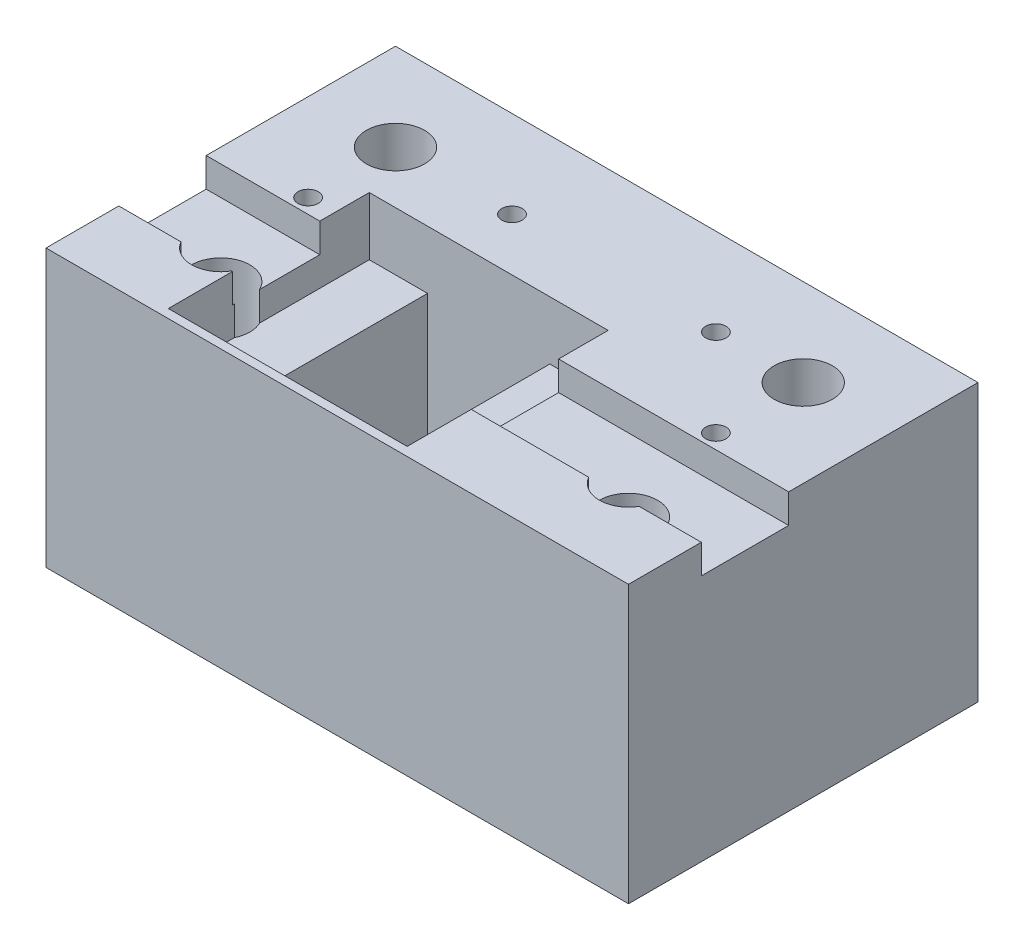
ISO-10303-21;
HEADER;
FILE_DESCRIPTION(('STEP AP214'),'2;1');
FILE_NAME('part.step','',(''),(''),'','','');
FILE_SCHEMA(('AUTOMOTIVE_DESIGN { 1 0 10303 214 1 1 1 1 }'));
ENDSEC;
DATA;
#1=APPLICATION_CONTEXT('core data for automotive mechanical design processes');
#2=APPLICATION_PROTOCOL_DEFINITION('international standard','automotive_design',2000,#1);
#3=PRODUCT_CONTEXT('',#1,'mechanical');
#4=PRODUCT('Part','Part','',(#3));
#5=PRODUCT_RELATED_PRODUCT_CATEGORY('part','',(#4));
#6=PRODUCT_DEFINITION_FORMATION('','',#4);
#7=PRODUCT_DEFINITION_CONTEXT('part definition',#1,'design');
#8=PRODUCT_DEFINITION('design','',#6,#7);
#9=PRODUCT_DEFINITION_SHAPE('','',#8);
#10=(LENGTH_UNIT() NAMED_UNIT(*) SI_UNIT(.MILLI.,.METRE.));
#11=(NAMED_UNIT(*) PLANE_ANGLE_UNIT() SI_UNIT($,.RADIAN.));
#12=(NAMED_UNIT(*) SI_UNIT($,.STERADIAN.) SOLID_ANGLE_UNIT());
#13=UNCERTAINTY_MEASURE_WITH_UNIT(LENGTH_MEASURE(1.E-05),#10,'distance_accuracy_value','');
#14=(GEOMETRIC_REPRESENTATION_CONTEXT(3) GLOBAL_UNCERTAINTY_ASSIGNED_CONTEXT((#13)) GLOBAL_UNIT_ASSIGNED_CONTEXT((#10,
#11,#12)) REPRESENTATION_CONTEXT('',''));
#15=CARTESIAN_POINT('',(0.,0.,0.));
#16=DIRECTION('',(0.,0.,1.));
#17=DIRECTION('',(1.,0.,0.));
#18=AXIS2_PLACEMENT_3D('',#15,#16,#17);
#19=CARTESIAN_POINT('',(0.,8.5,0.));
#20=DIRECTION('',(0.,1.,0.));
#21=DIRECTION('',(0.,0.,1.));
#22=AXIS2_PLACEMENT_3D('',#19,#20,#21);
#23=PLANE('',#22);
#24=CARTESIAN_POINT('',(3.,8.5,9.));
#25=DIRECTION('',(0.,1.,0.));
#26=DIRECTION('',(0.,0.,1.));
#27=AXIS2_PLACEMENT_3D('',#24,#25,#26);
#28=CIRCLE('',#27,1.);
#29=CARTESIAN_POINT('',(3.86602540378444,8.5,9.5));
#30=VERTEX_POINT('',#29);
#31=CARTESIAN_POINT('',(3.9,8.5,9.43588989435407));
#32=VERTEX_POINT('',#31);
#33=EDGE_CURVE('E462',#30,#32,#28,.T.);
#34=ORIENTED_EDGE('',*,*,#33,.F.);
#35=DIRECTION('',(1.,0.,0.));
#36=VECTOR('',#35,1.);
#37=CARTESIAN_POINT('',(0.,8.5,9.5));
#38=LINE('',#37,#36);
#39=CARTESIAN_POINT('',(3.9,8.5,9.5));
#40=VERTEX_POINT('',#39);
#41=EDGE_CURVE('E429',#30,#40,#38,.T.);
#42=ORIENTED_EDGE('',*,*,#41,.T.);
#43=DIRECTION('',(0.,0.,1.));
#44=VECTOR('',#43,1.);
#45=CARTESIAN_POINT('',(3.9,8.5,0.));
#46=LINE('',#45,#44);
#47=EDGE_CURVE('E344',#32,#40,#46,.T.);
#48=ORIENTED_EDGE('',*,*,#47,.F.);
#49=EDGE_LOOP('',(#34,#42,#48));
#50=FACE_BOUND('',#49,.T.);
#51=ADVANCED_FACE('F61',(#50),#23,.T.);
#52=CARTESIAN_POINT('',(3.9,7.5,0.));
#53=DIRECTION('',(-1.,0.,0.));
#54=DIRECTION('',(0.,0.,1.));
#55=AXIS2_PLACEMENT_3D('',#52,#53,#54);
#56=PLANE('',#55);
#57=DIRECTION('',(0.,0.,1.));
#58=VECTOR('',#57,1.);
#59=CARTESIAN_POINT('',(3.9,7.5,0.));
#60=LINE('',#59,#58);
#61=CARTESIAN_POINT('',(3.9,7.5,9.43588989435407));
#62=VERTEX_POINT('',#61);
#63=CARTESIAN_POINT('',(3.9,7.5,11.7));
#64=VERTEX_POINT('',#63);
#65=EDGE_CURVE('E389',#62,#64,#60,.T.);
#66=ORIENTED_EDGE('',*,*,#65,.F.);
#67=DIRECTION('',(0.,1.,0.));
#68=VECTOR('',#67,1.);
#69=CARTESIAN_POINT('',(3.9,-2.82842712474619,9.43588989435407));
#70=LINE('',#69,#68);
#71=EDGE_CURVE('E83',#62,#32,#70,.T.);
#72=ORIENTED_EDGE('',*,*,#71,.T.);
#73=ORIENTED_EDGE('',*,*,#47,.T.);
#74=DIRECTION('',(0.,-1.,0.));
#75=VECTOR('',#74,1.);
#76=CARTESIAN_POINT('',(3.9,8.5,9.5));
#77=LINE('',#76,#75);
#78=CARTESIAN_POINT('',(3.9,9.5,9.5));
#79=VERTEX_POINT('',#78);
#80=EDGE_CURVE('E416',#79,#40,#77,.T.);
#81=ORIENTED_EDGE('',*,*,#80,.F.);
#82=DIRECTION('',(0.,0.,1.));
#83=VECTOR('',#82,1.);
#84=CARTESIAN_POINT('',(3.9,9.5,0.));
#85=LINE('',#84,#83);
#86=CARTESIAN_POINT('',(3.9,9.5,11.7));
#87=VERTEX_POINT('',#86);
#88=EDGE_CURVE('E399',#79,#87,#85,.T.);
#89=ORIENTED_EDGE('',*,*,#88,.T.);
#90=DIRECTION('',(0.,1.,0.));
#91=VECTOR('',#90,1.);
#92=CARTESIAN_POINT('',(3.9,7.5,11.7));
#93=LINE('',#92,#91);
#94=EDGE_CURVE('E408',#64,#87,#93,.T.);
#95=ORIENTED_EDGE('',*,*,#94,.F.);
#96=EDGE_LOOP('',(#66,#72,#73,#81,#89,#95));
#97=FACE_BOUND('',#96,.T.);
#98=ADVANCED_FACE('F545',(#97),#56,.F.);
#99=CARTESIAN_POINT('',(0.,8.5,9.5));
#100=DIRECTION('',(0.,0.,1.));
#101=DIRECTION('',(1.,0.,0.));
#102=AXIS2_PLACEMENT_3D('',#99,#100,#101);
#103=PLANE('',#102);
#104=CARTESIAN_POINT('',(17.8660254037844,8.5,9.5));
#105=VERTEX_POINT('',#104);
#106=CARTESIAN_POINT('',(20.,8.5,9.5));
#107=VERTEX_POINT('',#106);
#108=EDGE_CURVE('E248',#105,#107,#38,.T.);
#109=ORIENTED_EDGE('',*,*,#108,.F.);
#110=DIRECTION('',(0.,1.,0.));
#111=VECTOR('',#110,1.);
#112=CARTESIAN_POINT('',(17.8660254037844,-2.82842712474619,9.5));
#113=LINE('',#112,#111);
#114=CARTESIAN_POINT('',(17.8660254037844,9.5,9.5));
#115=VERTEX_POINT('',#114);
#116=EDGE_CURVE('E234',#105,#115,#113,.T.);
#117=ORIENTED_EDGE('',*,*,#116,.T.);
#118=DIRECTION('',(1.,0.,0.));
#119=VECTOR('',#118,1.);
#120=CARTESIAN_POINT('',(0.,9.5,9.5));
#121=LINE('',#120,#119);
#122=CARTESIAN_POINT('',(20.,9.5,9.5));
#123=VERTEX_POINT('',#122);
#124=EDGE_CURVE('E246',#115,#123,#121,.T.);
#125=ORIENTED_EDGE('',*,*,#124,.T.);
#126=DIRECTION('',(0.,1.,0.));
#127=VECTOR('',#126,1.);
#128=CARTESIAN_POINT('',(20.,8.5,9.5));
#129=LINE('',#128,#127);
#130=EDGE_CURVE('E292',#107,#123,#129,.T.);
#131=ORIENTED_EDGE('',*,*,#130,.F.);
#132=EDGE_LOOP('',(#109,#117,#125,#131));
#133=FACE_BOUND('',#132,.T.);
#134=ADVANCED_FACE('F244',(#133),#103,.F.);
#135=ORIENTED_EDGE('',*,*,#41,.F.);
#136=DIRECTION('',(0.,1.,0.));
#137=VECTOR('',#136,1.);
#138=CARTESIAN_POINT('',(3.86602540378444,-2.82842712474619,9.5));
#139=LINE('',#138,#137);
#140=CARTESIAN_POINT('',(3.86602540378444,9.5,9.5));
#141=VERTEX_POINT('',#140);
#142=EDGE_CURVE('E468',#30,#141,#139,.T.);
#143=ORIENTED_EDGE('',*,*,#142,.T.);
#144=EDGE_CURVE('E259',#141,#79,#121,.T.);
#145=ORIENTED_EDGE('',*,*,#144,.T.);
#146=ORIENTED_EDGE('',*,*,#80,.T.);
#147=EDGE_LOOP('',(#135,#143,#145,#146));
#148=FACE_BOUND('',#147,.T.);
#149=ADVANCED_FACE('F548',(#148),#103,.F.);
#150=CARTESIAN_POINT('',(0.,9.5,0.));
#151=DIRECTION('',(0.,-1.,0.));
#152=DIRECTION('',(0.,0.,-1.));
#153=AXIS2_PLACEMENT_3D('',#150,#151,#152);
#154=PLANE('',#153);
#155=CARTESIAN_POINT('',(17.,9.5,3.));
#156=DIRECTION('',(0.,1.,0.));
#157=DIRECTION('',(0.,0.,1.));
#158=AXIS2_PLACEMENT_3D('',#155,#156,#157);
#159=CIRCLE('',#158,1.);
#160=CARTESIAN_POINT('',(17.,9.5,4.));
#161=VERTEX_POINT('',#160);
#162=EDGE_CURVE('E925',#161,#161,#159,.T.);
#163=ORIENTED_EDGE('',*,*,#162,.F.);
#164=EDGE_LOOP('',(#163));
#165=FACE_BOUND('',#164,.T.);
#166=CARTESIAN_POINT('',(3.,9.5,3.));
#167=DIRECTION('',(0.,1.,0.));
#168=DIRECTION('',(0.,0.,1.));
#169=AXIS2_PLACEMENT_3D('',#166,#167,#168);
#170=CIRCLE('',#169,1.);
#171=CARTESIAN_POINT('',(3.,9.5,4.));
#172=VERTEX_POINT('',#171);
#173=EDGE_CURVE('E922',#172,#172,#170,.T.);
#174=ORIENTED_EDGE('',*,*,#173,.F.);
#175=EDGE_LOOP('',(#174));
#176=FACE_BOUND('',#175,.T.);
#177=CARTESIAN_POINT('',(3.,9.5,6.));
#178=DIRECTION('',(0.,1.,0.));
#179=DIRECTION('',(0.,0.,1.));
#180=AXIS2_PLACEMENT_3D('',#177,#178,#179);
#181=CIRCLE('',#180,0.35);
#182=CARTESIAN_POINT('',(3.,9.5,6.35));
#183=VERTEX_POINT('',#182);
#184=EDGE_CURVE('E493',#183,#183,#181,.T.);
#185=ORIENTED_EDGE('',*,*,#184,.F.);
#186=EDGE_LOOP('',(#185));
#187=FACE_BOUND('',#186,.T.);
#188=CARTESIAN_POINT('',(7.,9.5,3.));
#189=DIRECTION('',(0.,1.,0.));
#190=DIRECTION('',(0.,0.,1.));
#191=AXIS2_PLACEMENT_3D('',#188,#189,#190);
#192=CIRCLE('',#191,0.35);
#193=CARTESIAN_POINT('',(7.,9.5,3.35));
#194=VERTEX_POINT('',#193);
#195=EDGE_CURVE('E471',#194,#194,#192,.T.);
#196=ORIENTED_EDGE('',*,*,#195,.F.);
#197=EDGE_LOOP('',(#196));
#198=FACE_BOUND('',#197,.T.);
#199=CARTESIAN_POINT('',(14.,9.5,3.));
#200=DIRECTION('',(0.,1.,0.));
#201=DIRECTION('',(0.,0.,1.));
#202=AXIS2_PLACEMENT_3D('',#199,#200,#201);
#203=CIRCLE('',#202,0.349999999999999);
#204=CARTESIAN_POINT('',(14.,9.5,3.35));
#205=VERTEX_POINT('',#204);
#206=EDGE_CURVE('E478',#205,#205,#203,.T.);
#207=ORIENTED_EDGE('',*,*,#206,.F.);
#208=EDGE_LOOP('',(#207));
#209=FACE_BOUND('',#208,.T.);
#210=CARTESIAN_POINT('',(17.,9.5,6.));
#211=DIRECTION('',(0.,1.,0.));
#212=DIRECTION('',(0.,0.,1.));
#213=AXIS2_PLACEMENT_3D('',#210,#211,#212);
#214=CIRCLE('',#213,0.349999999999993);
#215=CARTESIAN_POINT('',(17.,9.5,6.34999999999999));
#216=VERTEX_POINT('',#215);
#217=EDGE_CURVE('E484',#216,#216,#214,.T.);
#218=ORIENTED_EDGE('',*,*,#217,.F.);
#219=EDGE_LOOP('',(#218));
#220=FACE_BOUND('',#219,.T.);
#221=DIRECTION('',(0.,0.,1.));
#222=VECTOR('',#221,1.);
#223=CARTESIAN_POINT('',(12.1,9.5,0.));
#224=LINE('',#223,#222);
#225=CARTESIAN_POINT('',(12.1,9.5,4.8));
#226=VERTEX_POINT('',#225);
#227=CARTESIAN_POINT('',(12.1,9.5,6.5));
#228=VERTEX_POINT('',#227);
#229=EDGE_CURVE('E397',#226,#228,#224,.T.);
#230=ORIENTED_EDGE('',*,*,#229,.T.);
#231=DIRECTION('',(1.,0.,0.));
#232=VECTOR('',#231,1.);
#233=CARTESIAN_POINT('',(0.,9.5,6.5));
#234=LINE('',#233,#232);
#235=CARTESIAN_POINT('',(20.,9.5,6.5));
#236=VERTEX_POINT('',#235);
#237=EDGE_CURVE('E271',#228,#236,#234,.T.);
#238=ORIENTED_EDGE('',*,*,#237,.T.);
#239=DIRECTION('',(0.,0.,1.));
#240=VECTOR('',#239,1.);
#241=CARTESIAN_POINT('',(20.,9.5,0.));
#242=LINE('',#241,#240);
#243=CARTESIAN_POINT('',(20.,9.5,0.));
#244=VERTEX_POINT('',#243);
#245=EDGE_CURVE('E323',#244,#236,#242,.T.);
#246=ORIENTED_EDGE('',*,*,#245,.F.);
#247=DIRECTION('',(1.,0.,0.));
#248=VECTOR('',#247,1.);
#249=CARTESIAN_POINT('',(0.,9.5,0.));
#250=LINE('',#249,#248);
#251=CARTESIAN_POINT('',(0.,9.5,0.));
#252=VERTEX_POINT('',#251);
#253=EDGE_CURVE('E319',#252,#244,#250,.T.);
#254=ORIENTED_EDGE('',*,*,#253,.F.);
#255=DIRECTION('',(0.,0.,1.));
#256=VECTOR('',#255,1.);
#257=CARTESIAN_POINT('',(0.,9.5,0.));
#258=LINE('',#257,#256);
#259=CARTESIAN_POINT('',(0.,9.5,6.5));
#260=VERTEX_POINT('',#259);
#261=EDGE_CURVE('E329',#252,#260,#258,.T.);
#262=ORIENTED_EDGE('',*,*,#261,.T.);
#263=CARTESIAN_POINT('',(3.9,9.5,6.5));
#264=VERTEX_POINT('',#263);
#265=EDGE_CURVE('E275',#260,#264,#234,.T.);
#266=ORIENTED_EDGE('',*,*,#265,.T.);
#267=CARTESIAN_POINT('',(3.9,9.5,4.8));
#268=VERTEX_POINT('',#267);
#269=EDGE_CURVE('E401',#268,#264,#85,.T.);
#270=ORIENTED_EDGE('',*,*,#269,.F.);
#271=DIRECTION('',(1.,0.,0.));
#272=VECTOR('',#271,1.);
#273=CARTESIAN_POINT('',(5.9,9.5,4.8));
#274=LINE('',#273,#272);
#275=EDGE_CURVE('E295',#268,#226,#274,.T.);
#276=ORIENTED_EDGE('',*,*,#275,.T.);
#277=EDGE_LOOP('',(#230,#238,#246,#254,#262,#266,#270,#276));
#278=FACE_BOUND('',#277,.T.);
#279=ADVANCED_FACE('F448',(#165,#176,#187,#198,#209,#220,#278),#154,.F.);
#280=ORIENTED_EDGE('',*,*,#144,.F.);
#281=CARTESIAN_POINT('',(3.,9.5,9.));
#282=DIRECTION('',(0.,1.,0.));
#283=DIRECTION('',(0.,0.,1.));
#284=AXIS2_PLACEMENT_3D('',#281,#282,#283);
#285=CIRCLE('',#284,1.);
#286=CARTESIAN_POINT('',(2.13397459621556,9.5,9.5));
#287=VERTEX_POINT('',#286);
#288=EDGE_CURVE('E915',#287,#141,#285,.T.);
#289=ORIENTED_EDGE('',*,*,#288,.F.);
#290=CARTESIAN_POINT('',(0.,9.5,9.5));
#291=VERTEX_POINT('',#290);
#292=EDGE_CURVE('E260',#291,#287,#121,.T.);
#293=ORIENTED_EDGE('',*,*,#292,.F.);
#294=CARTESIAN_POINT('',(0.,9.5,12.));
#295=VERTEX_POINT('',#294);
#296=EDGE_CURVE('E328',#291,#295,#258,.T.);
#297=ORIENTED_EDGE('',*,*,#296,.T.);
#298=DIRECTION('',(1.,0.,0.));
#299=VECTOR('',#298,1.);
#300=CARTESIAN_POINT('',(0.,9.5,12.));
#301=LINE('',#300,#299);
#302=CARTESIAN_POINT('',(20.,9.5,12.));
#303=VERTEX_POINT('',#302);
#304=EDGE_CURVE('E326',#295,#303,#301,.T.);
#305=ORIENTED_EDGE('',*,*,#304,.T.);
#306=EDGE_CURVE('E255',#123,#303,#242,.T.);
#307=ORIENTED_EDGE('',*,*,#306,.F.);
#308=ORIENTED_EDGE('',*,*,#124,.F.);
#309=CARTESIAN_POINT('',(17.,9.5,9.));
#310=DIRECTION('',(0.,1.,0.));
#311=DIRECTION('',(0.,0.,1.));
#312=AXIS2_PLACEMENT_3D('',#309,#310,#311);
#313=CIRCLE('',#312,1.);
#314=CARTESIAN_POINT('',(16.1339745962156,9.5,9.5));
#315=VERTEX_POINT('',#314);
#316=EDGE_CURVE('E231',#315,#115,#313,.T.);
#317=ORIENTED_EDGE('',*,*,#316,.F.);
#318=CARTESIAN_POINT('',(12.1,9.5,9.5));
#319=VERTEX_POINT('',#318);
#320=EDGE_CURVE('E256',#319,#315,#121,.T.);
#321=ORIENTED_EDGE('',*,*,#320,.F.);
#322=CARTESIAN_POINT('',(12.1,9.5,11.7));
#323=VERTEX_POINT('',#322);
#324=EDGE_CURVE('E400',#319,#323,#224,.T.);
#325=ORIENTED_EDGE('',*,*,#324,.T.);
#326=DIRECTION('',(1.,0.,0.));
#327=VECTOR('',#326,1.);
#328=CARTESIAN_POINT('',(5.9,9.5,11.7));
#329=LINE('',#328,#327);
#330=EDGE_CURVE('E297',#87,#323,#329,.T.);
#331=ORIENTED_EDGE('',*,*,#330,.F.);
#332=ORIENTED_EDGE('',*,*,#88,.F.);
#333=EDGE_LOOP('',(#280,#289,#293,#297,#305,#307,#308,#317,#321,#325,#331,#332));
#334=FACE_BOUND('',#333,.T.);
#335=ADVANCED_FACE('F253',(#334),#154,.F.);
#336=CARTESIAN_POINT('',(5.9,9.5,4.8));
#337=DIRECTION('',(1.,0.,0.));
#338=DIRECTION('',(0.,0.,-1.));
#339=AXIS2_PLACEMENT_3D('',#336,#337,#338);
#340=PLANE('',#339);
#341=DIRECTION('',(0.,-1.,0.));
#342=VECTOR('',#341,1.);
#343=CARTESIAN_POINT('',(5.9,9.5,4.8));
#344=LINE('',#343,#342);
#345=CARTESIAN_POINT('',(5.9,7.5,4.8));
#346=VERTEX_POINT('',#345);
#347=CARTESIAN_POINT('',(5.9,0.,4.8));
#348=VERTEX_POINT('',#347);
#349=EDGE_CURVE('E311',#346,#348,#344,.T.);
#350=ORIENTED_EDGE('',*,*,#349,.F.);
#351=DIRECTION('',(0.,0.,1.));
#352=VECTOR('',#351,1.);
#353=CARTESIAN_POINT('',(5.9,7.5,4.8));
#354=LINE('',#353,#352);
#355=CARTESIAN_POINT('',(5.9,7.5,11.7));
#356=VERTEX_POINT('',#355);
#357=EDGE_CURVE('E257',#346,#356,#354,.T.);
#358=ORIENTED_EDGE('',*,*,#357,.T.);
#359=DIRECTION('',(0.,-1.,0.));
#360=VECTOR('',#359,1.);
#361=CARTESIAN_POINT('',(5.9,9.5,11.7));
#362=LINE('',#361,#360);
#363=CARTESIAN_POINT('',(5.9,0.,11.7));
#364=VERTEX_POINT('',#363);
#365=EDGE_CURVE('E314',#356,#364,#362,.T.);
#366=ORIENTED_EDGE('',*,*,#365,.T.);
#367=DIRECTION('',(0.,0.,1.));
#368=VECTOR('',#367,1.);
#369=CARTESIAN_POINT('',(5.9,0.,4.8));
#370=LINE('',#369,#368);
#371=EDGE_CURVE('E298',#348,#364,#370,.T.);
#372=ORIENTED_EDGE('',*,*,#371,.F.);
#373=EDGE_LOOP('',(#350,#358,#366,#372));
#374=FACE_BOUND('',#373,.T.);
#375=ADVANCED_FACE('F519',(#374),#340,.T.);
#376=CARTESIAN_POINT('',(10.1,9.5,4.8));
#377=DIRECTION('',(1.,0.,0.));
#378=DIRECTION('',(0.,0.,-1.));
#379=AXIS2_PLACEMENT_3D('',#376,#377,#378);
#380=PLANE('',#379);
#381=DIRECTION('',(0.,0.,1.));
#382=VECTOR('',#381,1.);
#383=CARTESIAN_POINT('',(10.1,7.5,4.8));
#384=LINE('',#383,#382);
#385=CARTESIAN_POINT('',(10.1,7.5,4.8));
#386=VERTEX_POINT('',#385);
#387=CARTESIAN_POINT('',(10.1,7.5,11.7));
#388=VERTEX_POINT('',#387);
#389=EDGE_CURVE('E356',#386,#388,#384,.T.);
#390=ORIENTED_EDGE('',*,*,#389,.F.);
#391=DIRECTION('',(0.,-1.,0.));
#392=VECTOR('',#391,1.);
#393=CARTESIAN_POINT('',(10.1,9.5,4.8));
#394=LINE('',#393,#392);
#395=CARTESIAN_POINT('',(10.1,0.,4.8));
#396=VERTEX_POINT('',#395);
#397=EDGE_CURVE('E300',#386,#396,#394,.T.);
#398=ORIENTED_EDGE('',*,*,#397,.T.);
#399=DIRECTION('',(0.,0.,1.));
#400=VECTOR('',#399,1.);
#401=CARTESIAN_POINT('',(10.1,0.,4.8));
#402=LINE('',#401,#400);
#403=CARTESIAN_POINT('',(10.1,0.,11.7));
#404=VERTEX_POINT('',#403);
#405=EDGE_CURVE('E303',#396,#404,#402,.T.);
#406=ORIENTED_EDGE('',*,*,#405,.T.);
#407=DIRECTION('',(0.,-1.,0.));
#408=VECTOR('',#407,1.);
#409=CARTESIAN_POINT('',(10.1,9.5,11.7));
#410=LINE('',#409,#408);
#411=EDGE_CURVE('E316',#388,#404,#410,.T.);
#412=ORIENTED_EDGE('',*,*,#411,.F.);
#413=EDGE_LOOP('',(#390,#398,#406,#412));
#414=FACE_BOUND('',#413,.T.);
#415=ADVANCED_FACE('F569',(#414),#380,.F.);
#416=CARTESIAN_POINT('',(17.,8.5,9.));
#417=DIRECTION('',(0.,1.,0.));
#418=DIRECTION('',(0.,0.,1.));
#419=AXIS2_PLACEMENT_3D('',#416,#417,#418);
#420=CIRCLE('',#419,1.);
#421=CARTESIAN_POINT('',(16.1339745962156,8.5,9.5));
#422=VERTEX_POINT('',#421);
#423=EDGE_CURVE('E76',#105,#422,#420,.T.);
#424=ORIENTED_EDGE('',*,*,#423,.F.);
#425=ORIENTED_EDGE('',*,*,#108,.T.);
#426=DIRECTION('',(0.,0.,1.));
#427=VECTOR('',#426,1.);
#428=CARTESIAN_POINT('',(20.,8.5,0.));
#429=LINE('',#428,#427);
#430=CARTESIAN_POINT('',(20.,8.5,6.5));
#431=VERTEX_POINT('',#430);
#432=EDGE_CURVE('E282',#431,#107,#429,.T.);
#433=ORIENTED_EDGE('',*,*,#432,.F.);
#434=DIRECTION('',(1.,0.,0.));
#435=VECTOR('',#434,1.);
#436=CARTESIAN_POINT('',(0.,8.5,6.5));
#437=LINE('',#436,#435);
#438=CARTESIAN_POINT('',(12.1,8.5,6.5));
#439=VERTEX_POINT('',#438);
#440=EDGE_CURVE('E432',#439,#431,#437,.T.);
#441=ORIENTED_EDGE('',*,*,#440,.F.);
#442=DIRECTION('',(0.,0.,1.));
#443=VECTOR('',#442,1.);
#444=CARTESIAN_POINT('',(12.1,8.5,0.));
#445=LINE('',#444,#443);
#446=CARTESIAN_POINT('',(12.1,8.5,9.5));
#447=VERTEX_POINT('',#446);
#448=EDGE_CURVE('E418',#439,#447,#445,.T.);
#449=ORIENTED_EDGE('',*,*,#448,.T.);
#450=EDGE_CURVE('E430',#447,#422,#38,.T.);
#451=ORIENTED_EDGE('',*,*,#450,.T.);
#452=EDGE_LOOP('',(#424,#425,#433,#441,#449,#451));
#453=FACE_BOUND('',#452,.T.);
#454=ADVANCED_FACE('F443',(#453),#23,.T.);
#455=CARTESIAN_POINT('',(0.,8.5,6.5));
#456=DIRECTION('',(0.,0.,1.));
#457=DIRECTION('',(1.,0.,0.));
#458=AXIS2_PLACEMENT_3D('',#455,#456,#457);
#459=PLANE('',#458);
#460=ORIENTED_EDGE('',*,*,#237,.F.);
#461=DIRECTION('',(0.,-1.,0.));
#462=VECTOR('',#461,1.);
#463=CARTESIAN_POINT('',(12.1,8.5,6.5));
#464=LINE('',#463,#462);
#465=EDGE_CURVE('E262',#228,#439,#464,.T.);
#466=ORIENTED_EDGE('',*,*,#465,.T.);
#467=ORIENTED_EDGE('',*,*,#440,.T.);
#468=DIRECTION('',(0.,1.,0.));
#469=VECTOR('',#468,1.);
#470=CARTESIAN_POINT('',(20.,8.5,6.5));
#471=LINE('',#470,#469);
#472=EDGE_CURVE('E284',#431,#236,#471,.T.);
#473=ORIENTED_EDGE('',*,*,#472,.T.);
#474=EDGE_LOOP('',(#460,#466,#467,#473));
#475=FACE_BOUND('',#474,.T.);
#476=ADVANCED_FACE('F440',(#475),#459,.T.);
#477=ORIENTED_EDGE('',*,*,#320,.T.);
#478=DIRECTION('',(0.,1.,0.));
#479=VECTOR('',#478,1.);
#480=CARTESIAN_POINT('',(16.1339745962156,-2.82842712474619,9.5));
#481=LINE('',#480,#479);
#482=EDGE_CURVE('E13',#315,#422,#481,.F.);
#483=ORIENTED_EDGE('',*,*,#482,.T.);
#484=ORIENTED_EDGE('',*,*,#450,.F.);
#485=DIRECTION('',(0.,-1.,0.));
#486=VECTOR('',#485,1.);
#487=CARTESIAN_POINT('',(12.1,8.5,9.5));
#488=LINE('',#487,#486);
#489=EDGE_CURVE('E354',#319,#447,#488,.T.);
#490=ORIENTED_EDGE('',*,*,#489,.F.);
#491=EDGE_LOOP('',(#477,#483,#484,#490));
#492=FACE_BOUND('',#491,.T.);
#493=ADVANCED_FACE('F538',(#492),#103,.F.);
#494=CARTESIAN_POINT('',(0.,9.5,0.));
#495=DIRECTION('',(0.,0.,-1.));
#496=DIRECTION('',(-1.,0.,0.));
#497=AXIS2_PLACEMENT_3D('',#494,#495,#496);
#498=PLANE('',#497);
#499=DIRECTION('',(1.,0.,0.));
#500=VECTOR('',#499,1.);
#501=CARTESIAN_POINT('',(0.,0.,0.));
#502=LINE('',#501,#500);
#503=CARTESIAN_POINT('',(0.,0.,0.));
#504=VERTEX_POINT('',#503);
#505=CARTESIAN_POINT('',(20.,0.,0.));
#506=VERTEX_POINT('',#505);
#507=EDGE_CURVE('E313',#504,#506,#502,.T.);
#508=ORIENTED_EDGE('',*,*,#507,.F.);
#509=DIRECTION('',(0.,-1.,0.));
#510=VECTOR('',#509,1.);
#511=CARTESIAN_POINT('',(0.,9.5,0.));
#512=LINE('',#511,#510);
#513=EDGE_CURVE('E342',#252,#504,#512,.T.);
#514=ORIENTED_EDGE('',*,*,#513,.F.);
#515=ORIENTED_EDGE('',*,*,#253,.T.);
#516=DIRECTION('',(0.,-1.,0.));
#517=VECTOR('',#516,1.);
#518=CARTESIAN_POINT('',(20.,9.5,0.));
#519=LINE('',#518,#517);
#520=EDGE_CURVE('E332',#244,#506,#519,.T.);
#521=ORIENTED_EDGE('',*,*,#520,.T.);
#522=EDGE_LOOP('',(#508,#514,#515,#521));
#523=FACE_BOUND('',#522,.T.);
#524=ADVANCED_FACE('F63',(#523),#498,.T.);
#525=CARTESIAN_POINT('',(0.,9.5,0.));
#526=DIRECTION('',(1.,0.,0.));
#527=DIRECTION('',(0.,0.,-1.));
#528=AXIS2_PLACEMENT_3D('',#525,#526,#527);
#529=PLANE('',#528);
#530=ORIENTED_EDGE('',*,*,#296,.F.);
#531=DIRECTION('',(0.,1.,0.));
#532=VECTOR('',#531,1.);
#533=CARTESIAN_POINT('',(0.,8.5,9.5));
#534=LINE('',#533,#532);
#535=CARTESIAN_POINT('',(0.,8.5,9.5));
#536=VERTEX_POINT('',#535);
#537=EDGE_CURVE('E290',#536,#291,#534,.T.);
#538=ORIENTED_EDGE('',*,*,#537,.F.);
#539=DIRECTION('',(0.,0.,1.));
#540=VECTOR('',#539,1.);
#541=CARTESIAN_POINT('',(0.,8.5,0.));
#542=LINE('',#541,#540);
#543=CARTESIAN_POINT('',(0.,8.5,6.5));
#544=VERTEX_POINT('',#543);
#545=EDGE_CURVE('E428',#544,#536,#542,.T.);
#546=ORIENTED_EDGE('',*,*,#545,.F.);
#547=DIRECTION('',(0.,1.,0.));
#548=VECTOR('',#547,1.);
#549=CARTESIAN_POINT('',(0.,8.5,6.5));
#550=LINE('',#549,#548);
#551=EDGE_CURVE('E286',#544,#260,#550,.T.);
#552=ORIENTED_EDGE('',*,*,#551,.T.);
#553=ORIENTED_EDGE('',*,*,#261,.F.);
#554=ORIENTED_EDGE('',*,*,#513,.T.);
#555=DIRECTION('',(0.,0.,1.));
#556=VECTOR('',#555,1.);
#557=CARTESIAN_POINT('',(0.,0.,0.));
#558=LINE('',#557,#556);
#559=CARTESIAN_POINT('',(0.,0.,12.));
#560=VERTEX_POINT('',#559);
#561=EDGE_CURVE('E322',#504,#560,#558,.T.);
#562=ORIENTED_EDGE('',*,*,#561,.T.);
#563=DIRECTION('',(0.,-1.,0.));
#564=VECTOR('',#563,1.);
#565=CARTESIAN_POINT('',(0.,9.5,12.));
#566=LINE('',#565,#564);
#567=EDGE_CURVE('E345',#295,#560,#566,.T.);
#568=ORIENTED_EDGE('',*,*,#567,.F.);
#569=EDGE_LOOP('',(#530,#538,#546,#552,#553,#554,#562,#568));
#570=FACE_BOUND('',#569,.T.);
#571=ADVANCED_FACE('F455',(#570),#529,.F.);
#572=CARTESIAN_POINT('',(0.,9.5,12.));
#573=DIRECTION('',(0.,0.,-1.));
#574=DIRECTION('',(-1.,0.,0.));
#575=AXIS2_PLACEMENT_3D('',#572,#573,#574);
#576=PLANE('',#575);
#577=DIRECTION('',(1.,0.,0.));
#578=VECTOR('',#577,1.);
#579=CARTESIAN_POINT('',(0.,0.,12.));
#580=LINE('',#579,#578);
#581=CARTESIAN_POINT('',(20.,0.,12.));
#582=VERTEX_POINT('',#581);
#583=EDGE_CURVE('E338',#560,#582,#580,.T.);
#584=ORIENTED_EDGE('',*,*,#583,.T.);
#585=DIRECTION('',(0.,-1.,0.));
#586=VECTOR('',#585,1.);
#587=CARTESIAN_POINT('',(20.,9.5,12.));
#588=LINE('',#587,#586);
#589=EDGE_CURVE('E348',#303,#582,#588,.T.);
#590=ORIENTED_EDGE('',*,*,#589,.F.);
#591=ORIENTED_EDGE('',*,*,#304,.F.);
#592=ORIENTED_EDGE('',*,*,#567,.T.);
#593=EDGE_LOOP('',(#584,#590,#591,#592));
#594=FACE_BOUND('',#593,.T.);
#595=ADVANCED_FACE('F603',(#594),#576,.F.);
#596=CARTESIAN_POINT('',(20.,9.5,0.));
#597=DIRECTION('',(1.,0.,0.));
#598=DIRECTION('',(0.,0.,-1.));
#599=AXIS2_PLACEMENT_3D('',#596,#597,#598);
#600=PLANE('',#599);
#601=ORIENTED_EDGE('',*,*,#130,.T.);
#602=ORIENTED_EDGE('',*,*,#306,.T.);
#603=ORIENTED_EDGE('',*,*,#589,.T.);
#604=DIRECTION('',(0.,0.,1.));
#605=VECTOR('',#604,1.);
#606=CARTESIAN_POINT('',(20.,0.,0.));
#607=LINE('',#606,#605);
#608=EDGE_CURVE('E335',#506,#582,#607,.T.);
#609=ORIENTED_EDGE('',*,*,#608,.F.);
#610=ORIENTED_EDGE('',*,*,#520,.F.);
#611=ORIENTED_EDGE('',*,*,#245,.T.);
#612=ORIENTED_EDGE('',*,*,#472,.F.);
#613=ORIENTED_EDGE('',*,*,#432,.T.);
#614=EDGE_LOOP('',(#601,#602,#603,#609,#610,#611,#612,#613));
#615=FACE_BOUND('',#614,.T.);
#616=ADVANCED_FACE('F445',(#615),#600,.T.);
#617=CARTESIAN_POINT('',(0.,0.,0.));
#618=DIRECTION('',(0.,-1.,0.));
#619=DIRECTION('',(0.,0.,-1.));
#620=AXIS2_PLACEMENT_3D('',#617,#618,#619);
#621=PLANE('',#620);
#622=CARTESIAN_POINT('',(3.,0.,6.));
#623=DIRECTION('',(0.,1.,0.));
#624=DIRECTION('',(0.,0.,1.));
#625=AXIS2_PLACEMENT_3D('',#622,#623,#624);
#626=CIRCLE('',#625,0.35);
#627=CARTESIAN_POINT('',(3.,0.,6.35));
#628=VERTEX_POINT('',#627);
#629=EDGE_CURVE('E474',#628,#628,#626,.T.);
#630=ORIENTED_EDGE('',*,*,#629,.T.);
#631=EDGE_LOOP('',(#630));
#632=FACE_BOUND('',#631,.T.);
#633=CARTESIAN_POINT('',(17.,0.,9.));
#634=DIRECTION('',(0.,1.,0.));
#635=DIRECTION('',(0.,0.,1.));
#636=AXIS2_PLACEMENT_3D('',#633,#634,#635);
#637=CIRCLE('',#636,0.699999999999998);
#638=CARTESIAN_POINT('',(17.,0.,9.7));
#639=VERTEX_POINT('',#638);
#640=EDGE_CURVE('E489',#639,#639,#637,.T.);
#641=ORIENTED_EDGE('',*,*,#640,.T.);
#642=EDGE_LOOP('',(#641));
#643=FACE_BOUND('',#642,.T.);
#644=CARTESIAN_POINT('',(17.,0.,3.));
#645=DIRECTION('',(0.,1.,0.));
#646=DIRECTION('',(0.,0.,1.));
#647=AXIS2_PLACEMENT_3D('',#644,#645,#646);
#648=CIRCLE('',#647,0.699999999999998);
#649=CARTESIAN_POINT('',(17.,0.,3.7));
#650=VERTEX_POINT('',#649);
#651=EDGE_CURVE('E492',#650,#650,#648,.T.);
#652=ORIENTED_EDGE('',*,*,#651,.T.);
#653=EDGE_LOOP('',(#652));
#654=FACE_BOUND('',#653,.T.);
#655=CARTESIAN_POINT('',(3.,0.,9.));
#656=DIRECTION('',(0.,1.,0.));
#657=DIRECTION('',(0.,0.,1.));
#658=AXIS2_PLACEMENT_3D('',#655,#656,#657);
#659=CIRCLE('',#658,0.699999999999999);
#660=CARTESIAN_POINT('',(3.,0.,9.7));
#661=VERTEX_POINT('',#660);
#662=EDGE_CURVE('E498',#661,#661,#659,.T.);
#663=ORIENTED_EDGE('',*,*,#662,.T.);
#664=EDGE_LOOP('',(#663));
#665=FACE_BOUND('',#664,.T.);
#666=CARTESIAN_POINT('',(7.,0.,3.));
#667=DIRECTION('',(0.,1.,0.));
#668=DIRECTION('',(0.,0.,1.));
#669=AXIS2_PLACEMENT_3D('',#666,#667,#668);
#670=CIRCLE('',#669,0.35);
#671=CARTESIAN_POINT('',(7.,0.,3.35));
#672=VERTEX_POINT('',#671);
#673=EDGE_CURVE('E475',#672,#672,#670,.T.);
#674=ORIENTED_EDGE('',*,*,#673,.T.);
#675=EDGE_LOOP('',(#674));
#676=FACE_BOUND('',#675,.T.);
#677=CARTESIAN_POINT('',(14.,0.,3.));
#678=DIRECTION('',(0.,1.,0.));
#679=DIRECTION('',(0.,0.,1.));
#680=AXIS2_PLACEMENT_3D('',#677,#678,#679);
#681=CIRCLE('',#680,0.349999999999999);
#682=CARTESIAN_POINT('',(14.,0.,3.35));
#683=VERTEX_POINT('',#682);
#684=EDGE_CURVE('E481',#683,#683,#681,.T.);
#685=ORIENTED_EDGE('',*,*,#684,.T.);
#686=EDGE_LOOP('',(#685));
#687=FACE_BOUND('',#686,.T.);
#688=CARTESIAN_POINT('',(17.,0.,6.));
#689=DIRECTION('',(0.,1.,0.));
#690=DIRECTION('',(0.,0.,1.));
#691=AXIS2_PLACEMENT_3D('',#688,#689,#690);
#692=CIRCLE('',#691,0.349999999999993);
#693=CARTESIAN_POINT('',(17.,0.,6.34999999999999));
#694=VERTEX_POINT('',#693);
#695=EDGE_CURVE('E249',#694,#694,#692,.T.);
#696=ORIENTED_EDGE('',*,*,#695,.T.);
#697=EDGE_LOOP('',(#696));
#698=FACE_BOUND('',#697,.T.);
#699=CARTESIAN_POINT('',(3.,0.,3.));
#700=DIRECTION('',(0.,1.,0.));
#701=DIRECTION('',(0.,0.,1.));
#702=AXIS2_PLACEMENT_3D('',#699,#700,#701);
#703=CIRCLE('',#702,0.7);
#704=CARTESIAN_POINT('',(3.,0.,3.7));
#705=VERTEX_POINT('',#704);
#706=EDGE_CURVE('E501',#705,#705,#703,.T.);
#707=ORIENTED_EDGE('',*,*,#706,.T.);
#708=EDGE_LOOP('',(#707));
#709=FACE_BOUND('',#708,.T.);
#710=DIRECTION('',(1.,0.,0.));
#711=VECTOR('',#710,1.);
#712=CARTESIAN_POINT('',(5.9,0.,4.8));
#713=LINE('',#712,#711);
#714=EDGE_CURVE('E294',#348,#396,#713,.T.);
#715=ORIENTED_EDGE('',*,*,#714,.F.);
#716=ORIENTED_EDGE('',*,*,#371,.T.);
#717=DIRECTION('',(1.,0.,0.));
#718=VECTOR('',#717,1.);
#719=CARTESIAN_POINT('',(5.9,0.,11.7));
#720=LINE('',#719,#718);
#721=EDGE_CURVE('E306',#364,#404,#720,.T.);
#722=ORIENTED_EDGE('',*,*,#721,.T.);
#723=ORIENTED_EDGE('',*,*,#405,.F.);
#724=EDGE_LOOP('',(#715,#716,#722,#723));
#725=FACE_BOUND('',#724,.T.);
#726=ORIENTED_EDGE('',*,*,#507,.T.);
#727=ORIENTED_EDGE('',*,*,#608,.T.);
#728=ORIENTED_EDGE('',*,*,#583,.F.);
#729=ORIENTED_EDGE('',*,*,#561,.F.);
#730=EDGE_LOOP('',(#726,#727,#728,#729));
#731=FACE_BOUND('',#730,.T.);
#732=ADVANCED_FACE('F527',(#632,#643,#654,#665,#676,#687,#698,#709,#725,#731),#621,.T.);
#733=CARTESIAN_POINT('',(5.9,9.5,4.8));
#734=DIRECTION('',(0.,0.,-1.));
#735=DIRECTION('',(-1.,0.,0.));
#736=AXIS2_PLACEMENT_3D('',#733,#734,#735);
#737=PLANE('',#736);
#738=ORIENTED_EDGE('',*,*,#275,.F.);
#739=DIRECTION('',(0.,1.,0.));
#740=VECTOR('',#739,1.);
#741=CARTESIAN_POINT('',(3.9,7.5,4.8));
#742=LINE('',#741,#740);
#743=CARTESIAN_POINT('',(3.9,7.5,4.8));
#744=VERTEX_POINT('',#743);
#745=EDGE_CURVE('E406',#744,#268,#742,.T.);
#746=ORIENTED_EDGE('',*,*,#745,.F.);
#747=DIRECTION('',(1.,0.,0.));
#748=VECTOR('',#747,1.);
#749=CARTESIAN_POINT('',(0.,7.5,4.8));
#750=LINE('',#749,#748);
#751=EDGE_CURVE('E387',#744,#346,#750,.T.);
#752=ORIENTED_EDGE('',*,*,#751,.T.);
#753=ORIENTED_EDGE('',*,*,#349,.T.);
#754=ORIENTED_EDGE('',*,*,#714,.T.);
#755=ORIENTED_EDGE('',*,*,#397,.F.);
#756=CARTESIAN_POINT('',(12.1,7.5,4.8));
#757=VERTEX_POINT('',#756);
#758=EDGE_CURVE('E388',#386,#757,#750,.T.);
#759=ORIENTED_EDGE('',*,*,#758,.T.);
#760=DIRECTION('',(0.,1.,0.));
#761=VECTOR('',#760,1.);
#762=CARTESIAN_POINT('',(12.1,7.5,4.8));
#763=LINE('',#762,#761);
#764=EDGE_CURVE('E396',#757,#226,#763,.T.);
#765=ORIENTED_EDGE('',*,*,#764,.T.);
#766=EDGE_LOOP('',(#738,#746,#752,#753,#754,#755,#759,#765));
#767=FACE_BOUND('',#766,.T.);
#768=ADVANCED_FACE('F531',(#767),#737,.F.);
#769=CARTESIAN_POINT('',(5.9,9.5,11.7));
#770=DIRECTION('',(0.,0.,-1.));
#771=DIRECTION('',(-1.,0.,0.));
#772=AXIS2_PLACEMENT_3D('',#769,#770,#771);
#773=PLANE('',#772);
#774=DIRECTION('',(1.,0.,0.));
#775=VECTOR('',#774,1.);
#776=CARTESIAN_POINT('',(0.,7.5,11.7));
#777=LINE('',#776,#775);
#778=CARTESIAN_POINT('',(12.1,7.5,11.7));
#779=VERTEX_POINT('',#778);
#780=EDGE_CURVE('E506',#388,#779,#777,.T.);
#781=ORIENTED_EDGE('',*,*,#780,.F.);
#782=ORIENTED_EDGE('',*,*,#411,.T.);
#783=ORIENTED_EDGE('',*,*,#721,.F.);
#784=ORIENTED_EDGE('',*,*,#365,.F.);
#785=EDGE_CURVE('E392',#64,#356,#777,.T.);
#786=ORIENTED_EDGE('',*,*,#785,.F.);
#787=ORIENTED_EDGE('',*,*,#94,.T.);
#788=ORIENTED_EDGE('',*,*,#330,.T.);
#789=DIRECTION('',(0.,1.,0.));
#790=VECTOR('',#789,1.);
#791=CARTESIAN_POINT('',(12.1,7.5,11.7));
#792=LINE('',#791,#790);
#793=EDGE_CURVE('E411',#779,#323,#792,.T.);
#794=ORIENTED_EDGE('',*,*,#793,.F.);
#795=EDGE_LOOP('',(#781,#782,#783,#784,#786,#787,#788,#794));
#796=FACE_BOUND('',#795,.T.);
#797=ADVANCED_FACE('F522',(#796),#773,.T.);
#798=ORIENTED_EDGE('',*,*,#292,.T.);
#799=DIRECTION('',(0.,1.,0.));
#800=VECTOR('',#799,1.);
#801=CARTESIAN_POINT('',(2.13397459621556,-2.82842712474619,9.5));
#802=LINE('',#801,#800);
#803=CARTESIAN_POINT('',(2.13397459621556,8.5,9.5));
#804=VERTEX_POINT('',#803);
#805=EDGE_CURVE('E464',#287,#804,#802,.F.);
#806=ORIENTED_EDGE('',*,*,#805,.T.);
#807=EDGE_CURVE('E425',#536,#804,#38,.T.);
#808=ORIENTED_EDGE('',*,*,#807,.F.);
#809=ORIENTED_EDGE('',*,*,#537,.T.);
#810=EDGE_LOOP('',(#798,#806,#808,#809));
#811=FACE_BOUND('',#810,.T.);
#812=ADVANCED_FACE('F557',(#811),#103,.F.);
#813=DIRECTION('',(0.,-1.,0.));
#814=VECTOR('',#813,1.);
#815=CARTESIAN_POINT('',(3.9,8.5,6.5));
#816=LINE('',#815,#814);
#817=CARTESIAN_POINT('',(3.9,8.5,6.5));
#818=VERTEX_POINT('',#817);
#819=EDGE_CURVE('E414',#264,#818,#816,.T.);
#820=ORIENTED_EDGE('',*,*,#819,.F.);
#821=ORIENTED_EDGE('',*,*,#265,.F.);
#822=ORIENTED_EDGE('',*,*,#551,.F.);
#823=EDGE_CURVE('E287',#544,#818,#437,.T.);
#824=ORIENTED_EDGE('',*,*,#823,.T.);
#825=EDGE_LOOP('',(#820,#821,#822,#824));
#826=FACE_BOUND('',#825,.T.);
#827=ADVANCED_FACE('F458',(#826),#459,.T.);
#828=CARTESIAN_POINT('',(3.9,8.5,8.56411010564593));
#829=VERTEX_POINT('',#828);
#830=EDGE_CURVE('E461',#829,#804,#28,.T.);
#831=ORIENTED_EDGE('',*,*,#830,.F.);
#832=EDGE_CURVE('E351',#818,#829,#46,.T.);
#833=ORIENTED_EDGE('',*,*,#832,.F.);
#834=ORIENTED_EDGE('',*,*,#823,.F.);
#835=ORIENTED_EDGE('',*,*,#545,.T.);
#836=ORIENTED_EDGE('',*,*,#807,.T.);
#837=EDGE_LOOP('',(#831,#833,#834,#835,#836));
#838=FACE_BOUND('',#837,.T.);
#839=ADVANCED_FACE('F460',(#838),#23,.T.);
#840=ORIENTED_EDGE('',*,*,#832,.T.);
#841=DIRECTION('',(0.,1.,0.));
#842=VECTOR('',#841,1.);
#843=CARTESIAN_POINT('',(3.9,-2.82842712474619,8.56411010564593));
#844=LINE('',#843,#842);
#845=CARTESIAN_POINT('',(3.9,7.5,8.56411010564593));
#846=VERTEX_POINT('',#845);
#847=EDGE_CURVE('E370',#829,#846,#844,.F.);
#848=ORIENTED_EDGE('',*,*,#847,.T.);
#849=EDGE_CURVE('E381',#744,#846,#60,.T.);
#850=ORIENTED_EDGE('',*,*,#849,.F.);
#851=ORIENTED_EDGE('',*,*,#745,.T.);
#852=ORIENTED_EDGE('',*,*,#269,.T.);
#853=ORIENTED_EDGE('',*,*,#819,.T.);
#854=EDGE_LOOP('',(#840,#848,#850,#851,#852,#853));
#855=FACE_BOUND('',#854,.T.);
#856=ADVANCED_FACE('F379',(#855),#56,.F.);
#857=CARTESIAN_POINT('',(0.,7.5,0.));
#858=DIRECTION('',(0.,1.,0.));
#859=DIRECTION('',(0.,0.,1.));
#860=AXIS2_PLACEMENT_3D('',#857,#858,#859);
#861=PLANE('',#860);
#862=CARTESIAN_POINT('',(3.,7.5,9.));
#863=DIRECTION('',(0.,1.,0.));
#864=DIRECTION('',(0.,0.,1.));
#865=AXIS2_PLACEMENT_3D('',#862,#863,#864);
#866=CIRCLE('',#865,1.);
#867=EDGE_CURVE('E69',#62,#846,#866,.T.);
#868=ORIENTED_EDGE('',*,*,#867,.F.);
#869=ORIENTED_EDGE('',*,*,#65,.T.);
#870=ORIENTED_EDGE('',*,*,#785,.T.);
#871=ORIENTED_EDGE('',*,*,#357,.F.);
#872=ORIENTED_EDGE('',*,*,#751,.F.);
#873=ORIENTED_EDGE('',*,*,#849,.T.);
#874=EDGE_LOOP('',(#868,#869,#870,#871,#872,#873));
#875=FACE_BOUND('',#874,.T.);
#876=ADVANCED_FACE('F385',(#875),#861,.T.);
#877=ORIENTED_EDGE('',*,*,#389,.T.);
#878=ORIENTED_EDGE('',*,*,#780,.T.);
#879=DIRECTION('',(0.,0.,1.));
#880=VECTOR('',#879,1.);
#881=CARTESIAN_POINT('',(12.1,7.5,0.));
#882=LINE('',#881,#880);
#883=EDGE_CURVE('E403',#757,#779,#882,.T.);
#884=ORIENTED_EDGE('',*,*,#883,.F.);
#885=ORIENTED_EDGE('',*,*,#758,.F.);
#886=EDGE_LOOP('',(#877,#878,#884,#885));
#887=FACE_BOUND('',#886,.T.);
#888=ADVANCED_FACE('F660',(#887),#861,.T.);
#889=CARTESIAN_POINT('',(12.1,7.5,0.));
#890=DIRECTION('',(-1.,0.,0.));
#891=DIRECTION('',(0.,0.,1.));
#892=AXIS2_PLACEMENT_3D('',#889,#890,#891);
#893=PLANE('',#892);
#894=ORIENTED_EDGE('',*,*,#229,.F.);
#895=ORIENTED_EDGE('',*,*,#764,.F.);
#896=ORIENTED_EDGE('',*,*,#883,.T.);
#897=ORIENTED_EDGE('',*,*,#793,.T.);
#898=ORIENTED_EDGE('',*,*,#324,.F.);
#899=ORIENTED_EDGE('',*,*,#489,.T.);
#900=ORIENTED_EDGE('',*,*,#448,.F.);
#901=ORIENTED_EDGE('',*,*,#465,.F.);
#902=EDGE_LOOP('',(#894,#895,#896,#897,#898,#899,#900,#901));
#903=FACE_BOUND('',#902,.T.);
#904=ADVANCED_FACE('F533',(#903),#893,.T.);
#905=CARTESIAN_POINT('',(3.,0.,9.));
#906=DIRECTION('',(0.,1.,0.));
#907=DIRECTION('',(0.,0.,1.));
#908=AXIS2_PLACEMENT_3D('',#905,#906,#907);
#909=CYLINDRICAL_SURFACE('',#908,0.699999999999999);
#910=CARTESIAN_POINT('',(3.,2.,9.));
#911=DIRECTION('',(0.,-1.,0.));
#912=DIRECTION('',(0.,0.,-1.));
#913=AXIS2_PLACEMENT_3D('',#910,#911,#912);
#914=CIRCLE('',#913,0.699999999999999);
#915=CARTESIAN_POINT('',(3.,2.,8.3));
#916=VERTEX_POINT('',#915);
#917=EDGE_CURVE('E368',#916,#916,#914,.F.);
#918=ORIENTED_EDGE('',*,*,#917,.T.);
#919=EDGE_LOOP('',(#918));
#920=FACE_BOUND('',#919,.T.);
#921=ORIENTED_EDGE('',*,*,#662,.F.);
#922=EDGE_LOOP('',(#921));
#923=FACE_BOUND('',#922,.T.);
#924=ADVANCED_FACE('F667',(#920,#923),#909,.F.);
#925=CARTESIAN_POINT('',(3.,0.,3.));
#926=DIRECTION('',(0.,1.,0.));
#927=DIRECTION('',(0.,0.,1.));
#928=AXIS2_PLACEMENT_3D('',#925,#926,#927);
#929=CYLINDRICAL_SURFACE('',#928,0.7);
#930=CARTESIAN_POINT('',(3.,2.,3.));
#931=DIRECTION('',(0.,-1.,0.));
#932=DIRECTION('',(0.,0.,-1.));
#933=AXIS2_PLACEMENT_3D('',#930,#931,#932);
#934=CIRCLE('',#933,0.7);
#935=CARTESIAN_POINT('',(3.,2.,2.3));
#936=VERTEX_POINT('',#935);
#937=EDGE_CURVE('E365',#936,#936,#934,.F.);
#938=ORIENTED_EDGE('',*,*,#937,.T.);
#939=EDGE_LOOP('',(#938));
#940=FACE_BOUND('',#939,.T.);
#941=ORIENTED_EDGE('',*,*,#706,.F.);
#942=EDGE_LOOP('',(#941));
#943=FACE_BOUND('',#942,.T.);
#944=ADVANCED_FACE('F672',(#940,#943),#929,.F.);
#945=CARTESIAN_POINT('',(17.,0.,6.));
#946=DIRECTION('',(0.,1.,0.));
#947=DIRECTION('',(0.,0.,1.));
#948=AXIS2_PLACEMENT_3D('',#945,#946,#947);
#949=CYLINDRICAL_SURFACE('',#948,0.349999999999993);
#950=ORIENTED_EDGE('',*,*,#695,.F.);
#951=EDGE_LOOP('',(#950));
#952=FACE_BOUND('',#951,.T.);
#953=ORIENTED_EDGE('',*,*,#217,.T.);
#954=EDGE_LOOP('',(#953));
#955=FACE_BOUND('',#954,.T.);
#956=ADVANCED_FACE('F684',(#952,#955),#949,.F.);
#957=CARTESIAN_POINT('',(14.,0.,3.));
#958=DIRECTION('',(0.,1.,0.));
#959=DIRECTION('',(0.,0.,1.));
#960=AXIS2_PLACEMENT_3D('',#957,#958,#959);
#961=CYLINDRICAL_SURFACE('',#960,0.349999999999999);
#962=ORIENTED_EDGE('',*,*,#684,.F.);
#963=EDGE_LOOP('',(#962));
#964=FACE_BOUND('',#963,.T.);
#965=ORIENTED_EDGE('',*,*,#206,.T.);
#966=EDGE_LOOP('',(#965));
#967=FACE_BOUND('',#966,.T.);
#968=ADVANCED_FACE('F800',(#964,#967),#961,.F.);
#969=CARTESIAN_POINT('',(7.,0.,3.));
#970=DIRECTION('',(0.,1.,0.));
#971=DIRECTION('',(0.,0.,1.));
#972=AXIS2_PLACEMENT_3D('',#969,#970,#971);
#973=CYLINDRICAL_SURFACE('',#972,0.35);
#974=ORIENTED_EDGE('',*,*,#673,.F.);
#975=EDGE_LOOP('',(#974));
#976=FACE_BOUND('',#975,.T.);
#977=ORIENTED_EDGE('',*,*,#195,.T.);
#978=EDGE_LOOP('',(#977));
#979=FACE_BOUND('',#978,.T.);
#980=ADVANCED_FACE('F698',(#976,#979),#973,.F.);
#981=CARTESIAN_POINT('',(17.,0.,3.));
#982=DIRECTION('',(0.,1.,0.));
#983=DIRECTION('',(0.,0.,1.));
#984=AXIS2_PLACEMENT_3D('',#981,#982,#983);
#985=CYLINDRICAL_SURFACE('',#984,0.699999999999998);
#986=CARTESIAN_POINT('',(17.,2.,3.));
#987=DIRECTION('',(0.,-1.,0.));
#988=DIRECTION('',(0.,0.,-1.));
#989=AXIS2_PLACEMENT_3D('',#986,#987,#988);
#990=CIRCLE('',#989,0.699999999999998);
#991=CARTESIAN_POINT('',(17.,2.,2.3));
#992=VERTEX_POINT('',#991);
#993=EDGE_CURVE('E361',#992,#992,#990,.F.);
#994=ORIENTED_EDGE('',*,*,#993,.T.);
#995=EDGE_LOOP('',(#994));
#996=FACE_BOUND('',#995,.T.);
#997=ORIENTED_EDGE('',*,*,#651,.F.);
#998=EDGE_LOOP('',(#997));
#999=FACE_BOUND('',#998,.T.);
#1000=ADVANCED_FACE('F692',(#996,#999),#985,.F.);
#1001=CARTESIAN_POINT('',(17.,0.,9.));
#1002=DIRECTION('',(0.,1.,0.));
#1003=DIRECTION('',(0.,0.,1.));
#1004=AXIS2_PLACEMENT_3D('',#1001,#1002,#1003);
#1005=CYLINDRICAL_SURFACE('',#1004,0.699999999999998);
#1006=CARTESIAN_POINT('',(17.,2.,9.));
#1007=DIRECTION('',(0.,-1.,0.));
#1008=DIRECTION('',(0.,0.,-1.));
#1009=AXIS2_PLACEMENT_3D('',#1006,#1007,#1008);
#1010=CIRCLE('',#1009,0.699999999999998);
#1011=CARTESIAN_POINT('',(17.,2.,8.3));
#1012=VERTEX_POINT('',#1011);
#1013=EDGE_CURVE('E358',#1012,#1012,#1010,.F.);
#1014=ORIENTED_EDGE('',*,*,#1013,.T.);
#1015=EDGE_LOOP('',(#1014));
#1016=FACE_BOUND('',#1015,.T.);
#1017=ORIENTED_EDGE('',*,*,#640,.F.);
#1018=EDGE_LOOP('',(#1017));
#1019=FACE_BOUND('',#1018,.T.);
#1020=ADVANCED_FACE('F697',(#1016,#1019),#1005,.F.);
#1021=CARTESIAN_POINT('',(3.,0.,6.));
#1022=DIRECTION('',(0.,1.,0.));
#1023=DIRECTION('',(0.,0.,1.));
#1024=AXIS2_PLACEMENT_3D('',#1021,#1022,#1023);
#1025=CYLINDRICAL_SURFACE('',#1024,0.35);
#1026=ORIENTED_EDGE('',*,*,#629,.F.);
#1027=EDGE_LOOP('',(#1026));
#1028=FACE_BOUND('',#1027,.T.);
#1029=ORIENTED_EDGE('',*,*,#184,.T.);
#1030=EDGE_LOOP('',(#1029));
#1031=FACE_BOUND('',#1030,.T.);
#1032=ADVANCED_FACE('F710',(#1028,#1031),#1025,.F.);
#1033=CARTESIAN_POINT('',(17.,-2.82842712474619,9.));
#1034=DIRECTION('',(0.,1.,0.));
#1035=DIRECTION('',(0.,0.,1.));
#1036=AXIS2_PLACEMENT_3D('',#1033,#1034,#1035);
#1037=CYLINDRICAL_SURFACE('',#1036,1.);
#1038=CARTESIAN_POINT('',(17.,2.,9.));
#1039=DIRECTION('',(0.,-1.,0.));
#1040=DIRECTION('',(0.,0.,-1.));
#1041=AXIS2_PLACEMENT_3D('',#1038,#1039,#1040);
#1042=CIRCLE('',#1041,1.);
#1043=CARTESIAN_POINT('',(17.,2.,8.));
#1044=VERTEX_POINT('',#1043);
#1045=EDGE_CURVE('E240',#1044,#1044,#1042,.F.);
#1046=ORIENTED_EDGE('',*,*,#1045,.F.);
#1047=EDGE_LOOP('',(#1046));
#1048=FACE_BOUND('',#1047,.T.);
#1049=ORIENTED_EDGE('',*,*,#423,.T.);
#1050=ORIENTED_EDGE('',*,*,#482,.F.);
#1051=ORIENTED_EDGE('',*,*,#316,.T.);
#1052=ORIENTED_EDGE('',*,*,#116,.F.);
#1053=EDGE_LOOP('',(#1049,#1050,#1051,#1052));
#1054=FACE_BOUND('',#1053,.T.);
#1055=ADVANCED_FACE('F233',(#1048,#1054),#1037,.F.);
#1056=CARTESIAN_POINT('',(0.,2.,0.));
#1057=DIRECTION('',(0.,-1.,0.));
#1058=DIRECTION('',(0.,0.,-1.));
#1059=AXIS2_PLACEMENT_3D('',#1056,#1057,#1058);
#1060=PLANE('',#1059);
#1061=ORIENTED_EDGE('',*,*,#1045,.T.);
#1062=EDGE_LOOP('',(#1061));
#1063=FACE_BOUND('',#1062,.T.);
#1064=ORIENTED_EDGE('',*,*,#1013,.F.);
#1065=EDGE_LOOP('',(#1064));
#1066=FACE_BOUND('',#1065,.T.);
#1067=ADVANCED_FACE('F722',(#1063,#1066),#1060,.F.);
#1068=CARTESIAN_POINT('',(0.,2.,0.));
#1069=DIRECTION('',(0.,-1.,0.));
#1070=DIRECTION('',(0.,0.,-1.));
#1071=AXIS2_PLACEMENT_3D('',#1068,#1069,#1070);
#1072=PLANE('',#1071);
#1073=CARTESIAN_POINT('',(17.,2.,3.));
#1074=DIRECTION('',(0.,-1.,0.));
#1075=DIRECTION('',(0.,0.,-1.));
#1076=AXIS2_PLACEMENT_3D('',#1073,#1074,#1075);
#1077=CIRCLE('',#1076,1.);
#1078=CARTESIAN_POINT('',(17.,2.,2.));
#1079=VERTEX_POINT('',#1078);
#1080=EDGE_CURVE('E239',#1079,#1079,#1077,.F.);
#1081=ORIENTED_EDGE('',*,*,#1080,.T.);
#1082=EDGE_LOOP('',(#1081));
#1083=FACE_BOUND('',#1082,.T.);
#1084=ORIENTED_EDGE('',*,*,#993,.F.);
#1085=EDGE_LOOP('',(#1084));
#1086=FACE_BOUND('',#1085,.T.);
#1087=ADVANCED_FACE('F733',(#1083,#1086),#1072,.F.);
#1088=CARTESIAN_POINT('',(17.,-2.82842712474619,3.));
#1089=DIRECTION('',(0.,1.,0.));
#1090=DIRECTION('',(0.,0.,1.));
#1091=AXIS2_PLACEMENT_3D('',#1088,#1089,#1090);
#1092=CYLINDRICAL_SURFACE('',#1091,1.);
#1093=ORIENTED_EDGE('',*,*,#162,.T.);
#1094=EDGE_LOOP('',(#1093));
#1095=FACE_BOUND('',#1094,.T.);
#1096=ORIENTED_EDGE('',*,*,#1080,.F.);
#1097=EDGE_LOOP('',(#1096));
#1098=FACE_BOUND('',#1097,.T.);
#1099=ADVANCED_FACE('F743',(#1095,#1098),#1092,.F.);
#1100=CARTESIAN_POINT('',(0.,2.,0.));
#1101=DIRECTION('',(0.,-1.,0.));
#1102=DIRECTION('',(0.,0.,-1.));
#1103=AXIS2_PLACEMENT_3D('',#1100,#1101,#1102);
#1104=PLANE('',#1103);
#1105=CARTESIAN_POINT('',(3.,2.,3.));
#1106=DIRECTION('',(0.,-1.,0.));
#1107=DIRECTION('',(0.,0.,-1.));
#1108=AXIS2_PLACEMENT_3D('',#1105,#1106,#1107);
#1109=CIRCLE('',#1108,1.);
#1110=CARTESIAN_POINT('',(3.,2.,2.));
#1111=VERTEX_POINT('',#1110);
#1112=EDGE_CURVE('E362',#1111,#1111,#1109,.F.);
#1113=ORIENTED_EDGE('',*,*,#1112,.T.);
#1114=EDGE_LOOP('',(#1113));
#1115=FACE_BOUND('',#1114,.T.);
#1116=ORIENTED_EDGE('',*,*,#937,.F.);
#1117=EDGE_LOOP('',(#1116));
#1118=FACE_BOUND('',#1117,.T.);
#1119=ADVANCED_FACE('F753',(#1115,#1118),#1104,.F.);
#1120=CARTESIAN_POINT('',(3.,-2.82842712474619,3.));
#1121=DIRECTION('',(0.,1.,0.));
#1122=DIRECTION('',(0.,0.,1.));
#1123=AXIS2_PLACEMENT_3D('',#1120,#1121,#1122);
#1124=CYLINDRICAL_SURFACE('',#1123,1.);
#1125=ORIENTED_EDGE('',*,*,#173,.T.);
#1126=EDGE_LOOP('',(#1125));
#1127=FACE_BOUND('',#1126,.T.);
#1128=ORIENTED_EDGE('',*,*,#1112,.F.);
#1129=EDGE_LOOP('',(#1128));
#1130=FACE_BOUND('',#1129,.T.);
#1131=ADVANCED_FACE('F763',(#1127,#1130),#1124,.F.);
#1132=CARTESIAN_POINT('',(3.,-2.82842712474619,9.));
#1133=DIRECTION('',(0.,1.,0.));
#1134=DIRECTION('',(0.,0.,1.));
#1135=AXIS2_PLACEMENT_3D('',#1132,#1133,#1134);
#1136=CYLINDRICAL_SURFACE('',#1135,1.);
#1137=CARTESIAN_POINT('',(3.,2.,9.));
#1138=DIRECTION('',(0.,-1.,0.));
#1139=DIRECTION('',(0.,0.,-1.));
#1140=AXIS2_PLACEMENT_3D('',#1137,#1138,#1139);
#1141=CIRCLE('',#1140,1.);
#1142=CARTESIAN_POINT('',(3.,2.,8.));
#1143=VERTEX_POINT('',#1142);
#1144=EDGE_CURVE('E916',#1143,#1143,#1141,.F.);
#1145=ORIENTED_EDGE('',*,*,#1144,.F.);
#1146=EDGE_LOOP('',(#1145));
#1147=FACE_BOUND('',#1146,.T.);
#1148=ORIENTED_EDGE('',*,*,#33,.T.);
#1149=ORIENTED_EDGE('',*,*,#71,.F.);
#1150=ORIENTED_EDGE('',*,*,#867,.T.);
#1151=ORIENTED_EDGE('',*,*,#847,.F.);
#1152=ORIENTED_EDGE('',*,*,#830,.T.);
#1153=ORIENTED_EDGE('',*,*,#805,.F.);
#1154=ORIENTED_EDGE('',*,*,#288,.T.);
#1155=ORIENTED_EDGE('',*,*,#142,.F.);
#1156=EDGE_LOOP('',(#1148,#1149,#1150,#1151,#1152,#1153,#1154,#1155));
#1157=FACE_BOUND('',#1156,.T.);
#1158=ADVANCED_FACE('F372',(#1147,#1157),#1136,.F.);
#1159=CARTESIAN_POINT('',(0.,2.,0.));
#1160=DIRECTION('',(0.,-1.,0.));
#1161=DIRECTION('',(0.,0.,-1.));
#1162=AXIS2_PLACEMENT_3D('',#1159,#1160,#1161);
#1163=PLANE('',#1162);
#1164=ORIENTED_EDGE('',*,*,#1144,.T.);
#1165=EDGE_LOOP('',(#1164));
#1166=FACE_BOUND('',#1165,.T.);
#1167=ORIENTED_EDGE('',*,*,#917,.F.);
#1168=EDGE_LOOP('',(#1167));
#1169=FACE_BOUND('',#1168,.T.);
#1170=ADVANCED_FACE('F782',(#1166,#1169),#1163,.F.);
#1171=CLOSED_SHELL('',(#51,#98,#134,#149,#279,#335,#375,#415,#454,#476,#493,#524,#571,#595,#616,
#732,#768,#797,#812,#827,#839,#856,#876,#888,#904,#924,#944,#956,#968,#980,#1000,#1020,#1032,
#1055,#1067,#1087,#1099,#1119,#1131,#1158,#1170));
#1172=MANIFOLD_SOLID_BREP('B2',#1171);
#1173=ADVANCED_BREP_SHAPE_REPRESENTATION('',(#18,#1172),#14);
#1174=SHAPE_DEFINITION_REPRESENTATION(#9,#1173);
ENDSEC;
END-ISO-10303-21;
